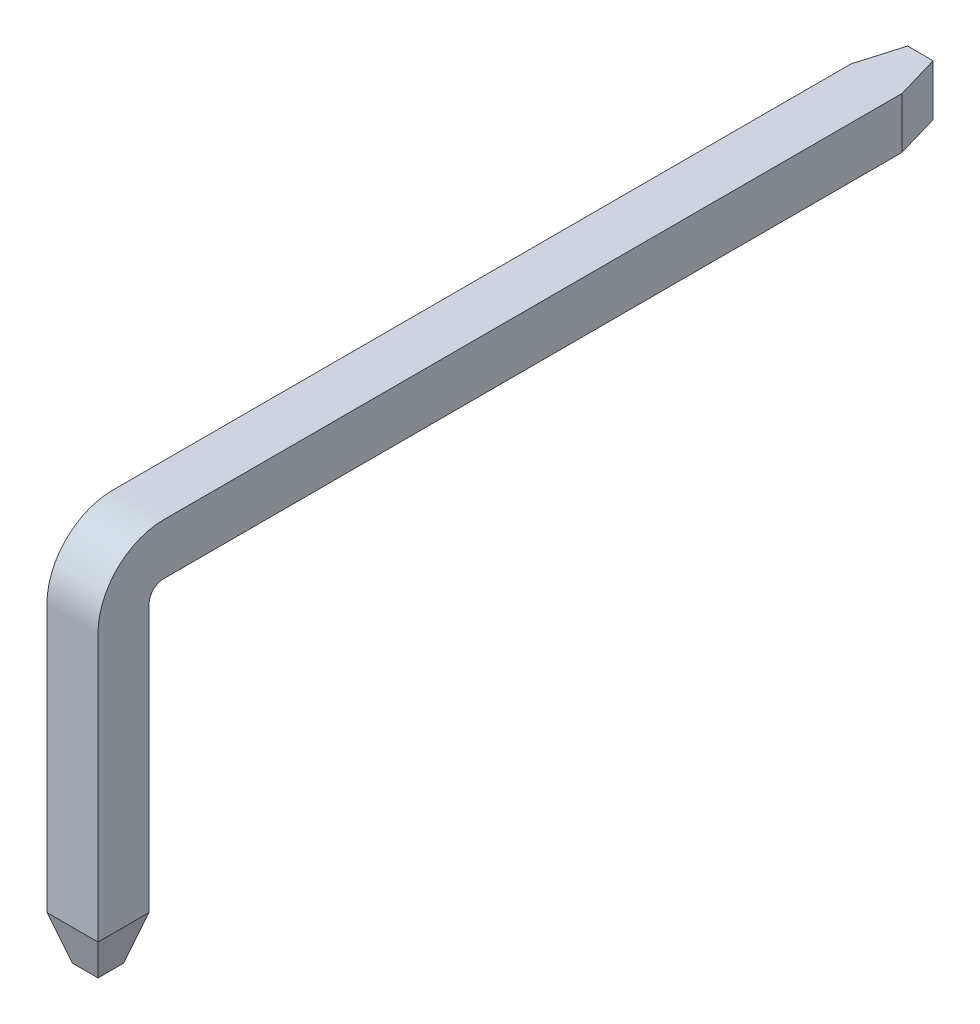
ISO-10303-21;
HEADER;
FILE_DESCRIPTION(('STEP AP214'),'2;1');
FILE_NAME('part.step','',(''),(''),'','','');
FILE_SCHEMA(('AUTOMOTIVE_DESIGN { 1 0 10303 214 1 1 1 1 }'));
ENDSEC;
DATA;
#1=APPLICATION_CONTEXT('core data for automotive mechanical design processes');
#2=APPLICATION_PROTOCOL_DEFINITION('international standard','automotive_design',2000,#1);
#3=PRODUCT_CONTEXT('',#1,'mechanical');
#4=PRODUCT('Part','Part','',(#3));
#5=PRODUCT_RELATED_PRODUCT_CATEGORY('part','',(#4));
#6=PRODUCT_DEFINITION_FORMATION('','',#4);
#7=PRODUCT_DEFINITION_CONTEXT('part definition',#1,'design');
#8=PRODUCT_DEFINITION('design','',#6,#7);
#9=PRODUCT_DEFINITION_SHAPE('','',#8);
#10=(LENGTH_UNIT() NAMED_UNIT(*) SI_UNIT(.MILLI.,.METRE.));
#11=(NAMED_UNIT(*) PLANE_ANGLE_UNIT() SI_UNIT($,.RADIAN.));
#12=(NAMED_UNIT(*) SI_UNIT($,.STERADIAN.) SOLID_ANGLE_UNIT());
#13=UNCERTAINTY_MEASURE_WITH_UNIT(LENGTH_MEASURE(1.E-05),#10,'distance_accuracy_value','');
#14=(GEOMETRIC_REPRESENTATION_CONTEXT(3) GLOBAL_UNCERTAINTY_ASSIGNED_CONTEXT((#13)) GLOBAL_UNIT_ASSIGNED_CONTEXT((#10,
#11,#12)) REPRESENTATION_CONTEXT('',''));
#15=CARTESIAN_POINT('',(0.,0.,0.));
#16=DIRECTION('',(0.,0.,1.));
#17=DIRECTION('',(1.,0.,0.));
#18=AXIS2_PLACEMENT_3D('',#15,#16,#17);
#19=CARTESIAN_POINT('',(0.,-4.4,10.3));
#20=DIRECTION('',(0.,-1.,0.));
#21=DIRECTION('',(1.,0.,0.));
#22=AXIS2_PLACEMENT_3D('',#19,#20,#21);
#23=PLANE('',#22);
#24=DIRECTION('',(-1.,0.,0.));
#25=VECTOR('',#24,1.);
#26=CARTESIAN_POINT('',(-0.32,-4.4,10.46));
#27=LINE('',#26,#25);
#28=CARTESIAN_POINT('',(0.16,-4.4,10.46));
#29=VERTEX_POINT('',#28);
#30=CARTESIAN_POINT('',(-0.16,-4.4,10.46));
#31=VERTEX_POINT('',#30);
#32=EDGE_CURVE('E310',#29,#31,#27,.T.);
#33=ORIENTED_EDGE('',*,*,#32,.T.);
#34=DIRECTION('',(0.,0.,-1.));
#35=VECTOR('',#34,1.);
#36=CARTESIAN_POINT('',(-0.16,-4.4,9.98));
#37=LINE('',#36,#35);
#38=CARTESIAN_POINT('',(-0.16,-4.4,10.14));
#39=VERTEX_POINT('',#38);
#40=EDGE_CURVE('E307',#31,#39,#37,.T.);
#41=ORIENTED_EDGE('',*,*,#40,.T.);
#42=DIRECTION('',(1.,0.,0.));
#43=VECTOR('',#42,1.);
#44=CARTESIAN_POINT('',(0.32,-4.4,10.14));
#45=LINE('',#44,#43);
#46=CARTESIAN_POINT('',(0.16,-4.4,10.14));
#47=VERTEX_POINT('',#46);
#48=EDGE_CURVE('E314',#39,#47,#45,.T.);
#49=ORIENTED_EDGE('',*,*,#48,.T.);
#50=DIRECTION('',(0.,0.,1.));
#51=VECTOR('',#50,1.);
#52=CARTESIAN_POINT('',(0.16,-4.4,10.62));
#53=LINE('',#52,#51);
#54=EDGE_CURVE('E312',#47,#29,#53,.T.);
#55=ORIENTED_EDGE('',*,*,#54,.T.);
#56=EDGE_LOOP('',(#33,#41,#49,#55));
#57=FACE_BOUND('',#56,.T.);
#58=ADVANCED_FACE('F35',(#57),#23,.T.);
#59=CARTESIAN_POINT('',(0.,0.,0.));
#60=DIRECTION('',(0.,0.,1.));
#61=DIRECTION('',(1.,0.,0.));
#62=AXIS2_PLACEMENT_3D('',#59,#60,#61);
#63=PLANE('',#62);
#64=DIRECTION('',(1.,0.,0.));
#65=VECTOR('',#64,1.);
#66=CARTESIAN_POINT('',(-0.32,-0.32,0.));
#67=LINE('',#66,#65);
#68=CARTESIAN_POINT('',(-0.160000000000001,-0.32,0.));
#69=VERTEX_POINT('',#68);
#70=CARTESIAN_POINT('',(0.16,-0.32,0.));
#71=VERTEX_POINT('',#70);
#72=EDGE_CURVE('E221',#69,#71,#67,.T.);
#73=ORIENTED_EDGE('',*,*,#72,.F.);
#74=DIRECTION('',(0.,1.,0.));
#75=VECTOR('',#74,1.);
#76=CARTESIAN_POINT('',(-0.160000000000001,0.,0.));
#77=LINE('',#76,#75);
#78=CARTESIAN_POINT('',(-0.160000000000001,0.32,0.));
#79=VERTEX_POINT('',#78);
#80=EDGE_CURVE('E273',#69,#79,#77,.T.);
#81=ORIENTED_EDGE('',*,*,#80,.T.);
#82=DIRECTION('',(-1.,0.,0.));
#83=VECTOR('',#82,1.);
#84=CARTESIAN_POINT('',(-0.32,0.32,0.));
#85=LINE('',#84,#83);
#86=CARTESIAN_POINT('',(0.16,0.32,0.));
#87=VERTEX_POINT('',#86);
#88=EDGE_CURVE('E133',#87,#79,#85,.T.);
#89=ORIENTED_EDGE('',*,*,#88,.F.);
#90=DIRECTION('',(0.,-1.,0.));
#91=VECTOR('',#90,1.);
#92=CARTESIAN_POINT('',(0.16,0.,0.));
#93=LINE('',#92,#91);
#94=EDGE_CURVE('E319',#87,#71,#93,.T.);
#95=ORIENTED_EDGE('',*,*,#94,.T.);
#96=EDGE_LOOP('',(#73,#81,#89,#95));
#97=FACE_BOUND('',#96,.T.);
#98=ADVANCED_FACE('F203',(#97),#63,.F.);
#99=CARTESIAN_POINT('',(-0.32,-4.4,10.62));
#100=DIRECTION('',(1.,0.,0.));
#101=DIRECTION('',(0.,0.,-1.));
#102=AXIS2_PLACEMENT_3D('',#99,#100,#101);
#103=PLANE('',#102);
#104=DIRECTION('',(0.,1.,0.));
#105=VECTOR('',#104,1.);
#106=CARTESIAN_POINT('',(-0.32,-4.4,9.98));
#107=LINE('',#106,#105);
#108=CARTESIAN_POINT('',(-0.32,-3.85,9.98));
#109=VERTEX_POINT('',#108);
#110=CARTESIAN_POINT('',(-0.32,-0.500000000000001,9.98));
#111=VERTEX_POINT('',#110);
#112=EDGE_CURVE('E167',#109,#111,#107,.T.);
#113=ORIENTED_EDGE('',*,*,#112,.F.);
#114=DIRECTION('',(0.,0.,1.));
#115=VECTOR('',#114,1.);
#116=CARTESIAN_POINT('',(-0.32,-3.85,10.62));
#117=LINE('',#116,#115);
#118=CARTESIAN_POINT('',(-0.32,-3.85,10.62));
#119=VERTEX_POINT('',#118);
#120=EDGE_CURVE('E163',#109,#119,#117,.T.);
#121=ORIENTED_EDGE('',*,*,#120,.T.);
#122=DIRECTION('',(0.,1.,0.));
#123=VECTOR('',#122,1.);
#124=CARTESIAN_POINT('',(-0.32,-4.4,10.62));
#125=LINE('',#124,#123);
#126=CARTESIAN_POINT('',(-0.32,-0.500000000000001,10.62));
#127=VERTEX_POINT('',#126);
#128=EDGE_CURVE('E301',#119,#127,#125,.T.);
#129=ORIENTED_EDGE('',*,*,#128,.T.);
#130=CARTESIAN_POINT('',(-0.32,-0.500000000000001,9.8));
#131=DIRECTION('',(-1.,0.,0.));
#132=DIRECTION('',(0.,0.,1.));
#133=AXIS2_PLACEMENT_3D('',#130,#131,#132);
#134=CIRCLE('',#133,0.820000000000001);
#135=CARTESIAN_POINT('',(-0.32,0.319999999999999,9.8));
#136=VERTEX_POINT('',#135);
#137=EDGE_CURVE('E161',#127,#136,#134,.T.);
#138=ORIENTED_EDGE('',*,*,#137,.T.);
#139=DIRECTION('',(0.,0.,-1.));
#140=VECTOR('',#139,1.);
#141=CARTESIAN_POINT('',(-0.32,0.319999999999999,9.8));
#142=LINE('',#141,#140);
#143=CARTESIAN_POINT('',(-0.32,0.32,0.550000000000002));
#144=VERTEX_POINT('',#143);
#145=EDGE_CURVE('E139',#136,#144,#142,.T.);
#146=ORIENTED_EDGE('',*,*,#145,.T.);
#147=DIRECTION('',(0.,-1.,0.));
#148=VECTOR('',#147,1.);
#149=CARTESIAN_POINT('',(-0.319999999999999,-4.4,0.550000000000002));
#150=LINE('',#149,#148);
#151=CARTESIAN_POINT('',(-0.32,-0.32,0.550000000000002));
#152=VERTEX_POINT('',#151);
#153=EDGE_CURVE('E231',#144,#152,#150,.T.);
#154=ORIENTED_EDGE('',*,*,#153,.T.);
#155=DIRECTION('',(0.,0.,-1.));
#156=VECTOR('',#155,1.);
#157=CARTESIAN_POINT('',(-0.32,-0.320000000000001,9.8));
#158=LINE('',#157,#156);
#159=CARTESIAN_POINT('',(-0.32,-0.320000000000001,9.8));
#160=VERTEX_POINT('',#159);
#161=EDGE_CURVE('E224',#160,#152,#158,.T.);
#162=ORIENTED_EDGE('',*,*,#161,.F.);
#163=CARTESIAN_POINT('',(-0.32,-0.500000000000001,9.8));
#164=DIRECTION('',(-1.,0.,0.));
#165=DIRECTION('',(0.,0.,1.));
#166=AXIS2_PLACEMENT_3D('',#163,#164,#165);
#167=CIRCLE('',#166,0.18);
#168=EDGE_CURVE('E170',#111,#160,#167,.T.);
#169=ORIENTED_EDGE('',*,*,#168,.F.);
#170=EDGE_LOOP('',(#113,#121,#129,#138,#146,#154,#162,#169));
#171=FACE_BOUND('',#170,.T.);
#172=ADVANCED_FACE('F193',(#171),#103,.F.);
#173=CARTESIAN_POINT('',(-0.32,-4.4,9.98));
#174=CARTESIAN_POINT('',(-0.32,-3.75000000000022,9.98));
#175=CARTESIAN_POINT('',(-0.32,-3.09999999999971,9.98));
#176=CARTESIAN_POINT('',(-0.32,-2.12500000000015,9.98));
#177=CARTESIAN_POINT('',(-0.32,-1.80000000000007,9.98));
#178=CARTESIAN_POINT('',(-0.32,-1.31249999999997,9.98));
#179=CARTESIAN_POINT('',(-0.32,-1.15,9.98));
#180=CARTESIAN_POINT('',(-0.32,-0.90625,9.98));
#181=CARTESIAN_POINT('',(-0.32,-0.824999999999983,9.98));
#182=CARTESIAN_POINT('',(-0.32,-0.70312500000001,9.98));
#183=CARTESIAN_POINT('',(-0.32,-0.662499999999999,9.98));
#184=CARTESIAN_POINT('',(-0.32,-0.58125,9.98));
#185=CARTESIAN_POINT('',(-0.32,-0.527624159814461,9.98000731082704));
#186=CARTESIAN_POINT('',(-0.32,-0.455495457674516,9.9799882217228));
#187=CARTESIAN_POINT('',(-0.32,-0.453294441046226,9.97541634727505));
#188=CARTESIAN_POINT('',(-0.32,-0.409822443711961,9.95754463056123));
#189=CARTESIAN_POINT('',(-0.32,-0.389586863291393,9.94414530451856));
#190=CARTESIAN_POINT('',(-0.32,-0.355854695481454,9.9104131367086));
#191=CARTESIAN_POINT('',(-0.32,-0.342455369438716,9.89017755628802));
#192=CARTESIAN_POINT('',(-0.32,-0.324583652725,9.8467055589538));
#193=CARTESIAN_POINT('',(-0.32,-0.32001177827718,9.8445045423256));
#194=CARTESIAN_POINT('',(-0.32,-0.319990814601934,9.76529272228431));
#195=CARTESIAN_POINT('',(-0.32,-0.320000000000001,9.69791666666671));
#196=CARTESIAN_POINT('',(-0.32,-0.320000000000001,9.59583333333329));
#197=CARTESIAN_POINT('',(-0.32,-0.320000000000001,9.54479166666679));
#198=CARTESIAN_POINT('',(-0.32,-0.320000000000001,9.3916666666664));
#199=CARTESIAN_POINT('',(-0.32,-0.320000000000001,9.28958333333342));
#200=CARTESIAN_POINT('',(-0.32,-0.320000000000001,8.98333333333316));
#201=CARTESIAN_POINT('',(-0.32,-0.320000000000001,8.77916666666666));
#202=CARTESIAN_POINT('',(-0.32,-0.320000000000001,8.16666666666667));
#203=CARTESIAN_POINT('',(-0.32,-0.320000000000012,7.75833333333368));
#204=CARTESIAN_POINT('',(-0.32,-0.319999999999979,6.53333333333263));
#205=CARTESIAN_POINT('',(-0.32,-0.320000000000001,5.71666666666767));
#206=CARTESIAN_POINT('',(-0.32,-0.320000000000001,3.26666666666466));
#207=CARTESIAN_POINT('',(-0.32,-0.32,1.63333333333483));
#208=CARTESIAN_POINT('',(-0.32,-0.32,0.));
#209=CARTESIAN_POINT('',(0.32,-4.4,9.98));
#210=CARTESIAN_POINT('',(0.32,-3.75000000000022,9.98));
#211=CARTESIAN_POINT('',(0.32,-3.09999999999971,9.98));
#212=CARTESIAN_POINT('',(0.32,-2.12500000000015,9.98));
#213=CARTESIAN_POINT('',(0.32,-1.80000000000007,9.98));
#214=CARTESIAN_POINT('',(0.32,-1.31249999999997,9.98));
#215=CARTESIAN_POINT('',(0.32,-1.15,9.98));
#216=CARTESIAN_POINT('',(0.32,-0.90625,9.98));
#217=CARTESIAN_POINT('',(0.32,-0.824999999999983,9.98));
#218=CARTESIAN_POINT('',(0.32,-0.70312500000001,9.98));
#219=CARTESIAN_POINT('',(0.32,-0.662499999999999,9.98));
#220=CARTESIAN_POINT('',(0.32,-0.58125,9.98));
#221=CARTESIAN_POINT('',(0.32,-0.527624159814461,9.98000731082704));
#222=CARTESIAN_POINT('',(0.32,-0.455495457674516,9.9799882217228));
#223=CARTESIAN_POINT('',(0.32,-0.453294441046226,9.97541634727505));
#224=CARTESIAN_POINT('',(0.32,-0.409822443711961,9.95754463056123));
#225=CARTESIAN_POINT('',(0.32,-0.389586863291393,9.94414530451856));
#226=CARTESIAN_POINT('',(0.32,-0.355854695481454,9.9104131367086));
#227=CARTESIAN_POINT('',(0.32,-0.342455369438716,9.89017755628802));
#228=CARTESIAN_POINT('',(0.32,-0.324583652725,9.8467055589538));
#229=CARTESIAN_POINT('',(0.32,-0.32001177827718,9.8445045423256));
#230=CARTESIAN_POINT('',(0.32,-0.319990814601934,9.76529272228431));
#231=CARTESIAN_POINT('',(0.32,-0.320000000000001,9.69791666666671));
#232=CARTESIAN_POINT('',(0.32,-0.320000000000001,9.59583333333329));
#233=CARTESIAN_POINT('',(0.32,-0.320000000000001,9.54479166666679));
#234=CARTESIAN_POINT('',(0.32,-0.320000000000001,9.3916666666664));
#235=CARTESIAN_POINT('',(0.32,-0.320000000000001,9.28958333333342));
#236=CARTESIAN_POINT('',(0.32,-0.320000000000001,8.98333333333316));
#237=CARTESIAN_POINT('',(0.32,-0.320000000000001,8.77916666666666));
#238=CARTESIAN_POINT('',(0.32,-0.320000000000001,8.16666666666667));
#239=CARTESIAN_POINT('',(0.32,-0.320000000000012,7.75833333333368));
#240=CARTESIAN_POINT('',(0.32,-0.319999999999979,6.53333333333263));
#241=CARTESIAN_POINT('',(0.32,-0.320000000000001,5.71666666666767));
#242=CARTESIAN_POINT('',(0.32,-0.320000000000001,3.26666666666466));
#243=CARTESIAN_POINT('',(0.32,-0.32,1.63333333333483));
#244=CARTESIAN_POINT('',(0.32,-0.32,0.));
#245=B_SPLINE_SURFACE_WITH_KNOTS('',1,3,((#173,#174,#175,#176,#177,#178,#179,#180,#181,#182,
#183,#184,#185,#186,#187,#188,#189,#190,#191,#192,#193,#194,#195,#196,#197,#198,#199,#200,#201,
#202,#203,#204,#205,#206,#207,#208),(#209,#210,#211,#212,#213,#214,#215,#216,#217,#218,#219,
#220,#221,#222,#223,#224,#225,#226,#227,#228,#229,#230,#231,#232,#233,#234,#235,#236,#237,#238,
#239,#240,#241,#242,#243,#244)),.UNSPECIFIED.,.F.,.F.,.F.,(2,2),(4,2,2,2,2,2,2,2,2,2,2,2,2,2,2,
2,2,4),(0.,1.),(0.,0.134618322396368,0.201927483594553,0.235582064193645,0.252409354493191,
0.260822999642964,0.269236644792737,0.282791642635013,0.296346640477289,0.309901638319565,
0.323456636161841,0.334027626221812,0.344598616281783,0.365740596401726,0.408024556641611,
0.492592477121381,0.66172831808092,1.),.UNSPECIFIED.);
#246=DIRECTION('',(0.,1.,0.));
#247=VECTOR('',#246,1.);
#248=CARTESIAN_POINT('',(0.32,-4.4,9.98));
#249=LINE('',#248,#247);
#250=CARTESIAN_POINT('',(0.32,-3.85,9.98));
#251=VERTEX_POINT('',#250);
#252=CARTESIAN_POINT('',(0.32,-0.500000000000001,9.98));
#253=VERTEX_POINT('',#252);
#254=EDGE_CURVE('E162',#251,#253,#249,.T.);
#255=DIRECTION('',(1.,0.,0.));
#256=VECTOR('',#255,1.);
#257=CARTESIAN_POINT('',(0.32,-3.85,9.98));
#258=LINE('',#257,#256);
#259=EDGE_CURVE('E11',#251,#109,#258,.F.);
#260=CARTESIAN_POINT('',(-0.319999999999999,-0.32,0.550000000000002));
#261=CARTESIAN_POINT('',(-0.307010212911242,-0.32,0.505347606882397));
#262=CARTESIAN_POINT('',(-0.294020425822484,-0.32,0.460695213764793));
#263=CARTESIAN_POINT('',(-0.240687092489151,-0.32,0.277361880431459));
#264=CARTESIAN_POINT('',(-0.200343546244576,-0.32,0.138680940215729));
#265=CARTESIAN_POINT('',(-0.160000000000001,-0.32,0.));
#266=B_SPLINE_CURVE_WITH_KNOTS('',3,(#260,#261,#262,#263,#264,#265),.UNSPECIFIED.,.F.,.F.,(4,2,
4),(0.,0.139510347349805,0.572800139664789),.UNSPECIFIED.);
#267=EDGE_CURVE('E238',#152,#69,#266,.T.);
#268=CARTESIAN_POINT('',(0.16,-0.32,0.));
#269=CARTESIAN_POINT('',(0.172989787088758,-0.32,0.0446523931176045));
#270=CARTESIAN_POINT('',(0.185979574177516,-0.32,0.0893047862352089));
#271=CARTESIAN_POINT('',(0.239312907510849,-0.32,0.272638119568544));
#272=CARTESIAN_POINT('',(0.279656453755425,-0.32,0.411319059784275));
#273=CARTESIAN_POINT('',(0.32,-0.32,0.550000000000006));
#274=B_SPLINE_CURVE_WITH_KNOTS('',3,(#268,#269,#270,#271,#272,#273),.UNSPECIFIED.,.F.,.F.,(4,2,
4),(0.,0.139510347349805,0.572800139664793),.UNSPECIFIED.);
#275=CARTESIAN_POINT('',(0.32,-0.32,0.550000000000005));
#276=VERTEX_POINT('',#275);
#277=EDGE_CURVE('E239',#71,#276,#274,.T.);
#278=DIRECTION('',(0.,0.,-1.));
#279=VECTOR('',#278,1.);
#280=CARTESIAN_POINT('',(0.32,-0.320000000000001,9.8));
#281=LINE('',#280,#279);
#282=CARTESIAN_POINT('',(0.32,-0.320000000000001,9.8));
#283=VERTEX_POINT('',#282);
#284=EDGE_CURVE('E134',#283,#276,#281,.T.);
#285=CARTESIAN_POINT('',(0.32,-0.500000000000001,9.8));
#286=DIRECTION('',(-1.,0.,0.));
#287=DIRECTION('',(0.,0.,1.));
#288=AXIS2_PLACEMENT_3D('',#285,#286,#287);
#289=CIRCLE('',#288,0.18);
#290=EDGE_CURVE('E140',#253,#283,#289,.T.);
#291=ORIENTED_EDGE('',*,*,#254,.F.);
#292=ORIENTED_EDGE('',*,*,#259,.T.);
#293=ORIENTED_EDGE('',*,*,#112,.T.);
#294=ORIENTED_EDGE('',*,*,#168,.T.);
#295=ORIENTED_EDGE('',*,*,#161,.T.);
#296=ORIENTED_EDGE('',*,*,#267,.T.);
#297=ORIENTED_EDGE('',*,*,#72,.T.);
#298=ORIENTED_EDGE('',*,*,#277,.T.);
#299=ORIENTED_EDGE('',*,*,#284,.F.);
#300=ORIENTED_EDGE('',*,*,#290,.F.);
#301=EDGE_LOOP('',(#291,#292,#293,#294,#295,#296,#297,#298,#299,#300));
#302=FACE_BOUND('',#301,.T.);
#303=ADVANCED_FACE('F202',(#302),#245,.F.);
#304=CARTESIAN_POINT('',(0.32,-4.4,10.62));
#305=DIRECTION('',(-1.,0.,0.));
#306=DIRECTION('',(0.,0.,1.));
#307=AXIS2_PLACEMENT_3D('',#304,#305,#306);
#308=PLANE('',#307);
#309=DIRECTION('',(0.,1.,0.));
#310=VECTOR('',#309,1.);
#311=CARTESIAN_POINT('',(0.32,-4.4,10.62));
#312=LINE('',#311,#310);
#313=CARTESIAN_POINT('',(0.32,-3.85,10.62));
#314=VERTEX_POINT('',#313);
#315=CARTESIAN_POINT('',(0.32,-0.500000000000001,10.62));
#316=VERTEX_POINT('',#315);
#317=EDGE_CURVE('E138',#314,#316,#312,.T.);
#318=ORIENTED_EDGE('',*,*,#317,.F.);
#319=DIRECTION('',(0.,0.,-1.));
#320=VECTOR('',#319,1.);
#321=CARTESIAN_POINT('',(0.32,-3.85,9.98));
#322=LINE('',#321,#320);
#323=EDGE_CURVE('E44',#314,#251,#322,.T.);
#324=ORIENTED_EDGE('',*,*,#323,.T.);
#325=ORIENTED_EDGE('',*,*,#254,.T.);
#326=ORIENTED_EDGE('',*,*,#290,.T.);
#327=ORIENTED_EDGE('',*,*,#284,.T.);
#328=DIRECTION('',(0.,1.,0.));
#329=VECTOR('',#328,1.);
#330=CARTESIAN_POINT('',(0.32,-4.4,0.550000000000005));
#331=LINE('',#330,#329);
#332=CARTESIAN_POINT('',(0.32,0.32,0.550000000000005));
#333=VERTEX_POINT('',#332);
#334=EDGE_CURVE('E132',#276,#333,#331,.T.);
#335=ORIENTED_EDGE('',*,*,#334,.T.);
#336=DIRECTION('',(0.,0.,-1.));
#337=VECTOR('',#336,1.);
#338=CARTESIAN_POINT('',(0.32,0.319999999999999,9.8));
#339=LINE('',#338,#337);
#340=CARTESIAN_POINT('',(0.32,0.319999999999999,9.8));
#341=VERTEX_POINT('',#340);
#342=EDGE_CURVE('E125',#341,#333,#339,.T.);
#343=ORIENTED_EDGE('',*,*,#342,.F.);
#344=CARTESIAN_POINT('',(0.32,-0.500000000000001,9.8));
#345=DIRECTION('',(-1.,0.,0.));
#346=DIRECTION('',(0.,0.,1.));
#347=AXIS2_PLACEMENT_3D('',#344,#345,#346);
#348=CIRCLE('',#347,0.820000000000001);
#349=EDGE_CURVE('E128',#316,#341,#348,.T.);
#350=ORIENTED_EDGE('',*,*,#349,.F.);
#351=EDGE_LOOP('',(#318,#324,#325,#326,#327,#335,#343,#350));
#352=FACE_BOUND('',#351,.T.);
#353=ADVANCED_FACE('F127',(#352),#308,.F.);
#354=CARTESIAN_POINT('',(0.32,-4.4,10.62));
#355=CARTESIAN_POINT('',(0.32,-3.75000000000022,10.62));
#356=CARTESIAN_POINT('',(0.32,-3.09999999999971,10.62));
#357=CARTESIAN_POINT('',(0.32,-2.12500000000015,10.62));
#358=CARTESIAN_POINT('',(0.32,-1.80000000000007,10.62));
#359=CARTESIAN_POINT('',(0.32,-1.31249999999997,10.62));
#360=CARTESIAN_POINT('',(0.32,-1.15,10.62));
#361=CARTESIAN_POINT('',(0.32,-0.90625,10.62));
#362=CARTESIAN_POINT('',(0.32,-0.824999999999983,10.62));
#363=CARTESIAN_POINT('',(0.32,-0.70312500000001,10.62));
#364=CARTESIAN_POINT('',(0.32,-0.662499999999999,10.62));
#365=CARTESIAN_POINT('',(0.32,-0.58125,10.62));
#366=CARTESIAN_POINT('',(0.32,-0.553621172488102,10.6200333048787));
#367=CARTESIAN_POINT('',(0.32,-0.413612368427957,10.6199463434039));
#368=CARTESIAN_POINT('',(0.32,-0.2872302314328,10.5991189153639));
#369=CARTESIAN_POINT('',(0.32,-0.0891911324655984,10.5177033170014));
#370=CARTESIAN_POINT('',(0.32,0.00299317833920369,10.4566619428067));
#371=CARTESIAN_POINT('',(0.32,0.15666194280672,10.3029931783393));
#372=CARTESIAN_POINT('',(0.32,0.217703317001405,10.2108088675344));
#373=CARTESIAN_POINT('',(0.32,0.299118915363896,10.0127697685672));
#374=CARTESIAN_POINT('',(0.32,0.319946343403956,9.88638763157213));
#375=CARTESIAN_POINT('',(0.32,0.320041844591198,9.73262980892514));
#376=CARTESIAN_POINT('',(0.32,0.319999999999999,9.69791666666671));
#377=CARTESIAN_POINT('',(0.32,0.319999999999999,9.59583333333329));
#378=CARTESIAN_POINT('',(0.32,0.319999999999999,9.54479166666679));
#379=CARTESIAN_POINT('',(0.32,0.319999999999999,9.3916666666664));
#380=CARTESIAN_POINT('',(0.32,0.319999999999999,9.28958333333342));
#381=CARTESIAN_POINT('',(0.32,0.319999999999999,8.98333333333316));
#382=CARTESIAN_POINT('',(0.32,0.319999999999999,8.77916666666666));
#383=CARTESIAN_POINT('',(0.32,0.319999999999999,8.16666666666667));
#384=CARTESIAN_POINT('',(0.32,0.319999999999988,7.75833333333368));
#385=CARTESIAN_POINT('',(0.32,0.320000000000021,6.53333333333263));
#386=CARTESIAN_POINT('',(0.32,0.319999999999999,5.71666666666767));
#387=CARTESIAN_POINT('',(0.32,0.319999999999999,3.26666666666466));
#388=CARTESIAN_POINT('',(0.32,0.32,1.63333333333483));
#389=CARTESIAN_POINT('',(0.32,0.32,0.));
#390=CARTESIAN_POINT('',(-0.32,-4.4,10.62));
#391=CARTESIAN_POINT('',(-0.32,-3.75000000000022,10.62));
#392=CARTESIAN_POINT('',(-0.32,-3.09999999999971,10.62));
#393=CARTESIAN_POINT('',(-0.32,-2.12500000000015,10.62));
#394=CARTESIAN_POINT('',(-0.32,-1.80000000000007,10.62));
#395=CARTESIAN_POINT('',(-0.32,-1.31249999999997,10.62));
#396=CARTESIAN_POINT('',(-0.32,-1.15,10.62));
#397=CARTESIAN_POINT('',(-0.32,-0.90625,10.62));
#398=CARTESIAN_POINT('',(-0.32,-0.824999999999983,10.62));
#399=CARTESIAN_POINT('',(-0.32,-0.70312500000001,10.62));
#400=CARTESIAN_POINT('',(-0.32,-0.662499999999999,10.62));
#401=CARTESIAN_POINT('',(-0.32,-0.58125,10.62));
#402=CARTESIAN_POINT('',(-0.32,-0.553621172488102,10.6200333048787));
#403=CARTESIAN_POINT('',(-0.32,-0.413612368427957,10.6199463434039));
#404=CARTESIAN_POINT('',(-0.32,-0.2872302314328,10.5991189153639));
#405=CARTESIAN_POINT('',(-0.32,-0.0891911324655984,10.5177033170014));
#406=CARTESIAN_POINT('',(-0.32,0.00299317833920369,10.4566619428067));
#407=CARTESIAN_POINT('',(-0.32,0.15666194280672,10.3029931783393));
#408=CARTESIAN_POINT('',(-0.32,0.217703317001405,10.2108088675344));
#409=CARTESIAN_POINT('',(-0.32,0.299118915363896,10.0127697685672));
#410=CARTESIAN_POINT('',(-0.32,0.319946343403956,9.88638763157213));
#411=CARTESIAN_POINT('',(-0.32,0.320041844591198,9.73262980892514));
#412=CARTESIAN_POINT('',(-0.32,0.319999999999999,9.69791666666671));
#413=CARTESIAN_POINT('',(-0.32,0.319999999999999,9.59583333333329));
#414=CARTESIAN_POINT('',(-0.32,0.319999999999999,9.54479166666679));
#415=CARTESIAN_POINT('',(-0.32,0.319999999999999,9.3916666666664));
#416=CARTESIAN_POINT('',(-0.32,0.319999999999999,9.28958333333342));
#417=CARTESIAN_POINT('',(-0.32,0.319999999999999,8.98333333333316));
#418=CARTESIAN_POINT('',(-0.32,0.319999999999999,8.77916666666666));
#419=CARTESIAN_POINT('',(-0.32,0.319999999999999,8.16666666666667));
#420=CARTESIAN_POINT('',(-0.32,0.319999999999988,7.75833333333368));
#421=CARTESIAN_POINT('',(-0.32,0.320000000000021,6.53333333333263));
#422=CARTESIAN_POINT('',(-0.32,0.319999999999999,5.71666666666767));
#423=CARTESIAN_POINT('',(-0.32,0.319999999999999,3.26666666666466));
#424=CARTESIAN_POINT('',(-0.32,0.32,1.63333333333483));
#425=CARTESIAN_POINT('',(-0.32,0.32,0.));
#426=B_SPLINE_SURFACE_WITH_KNOTS('',1,3,((#354,#355,#356,#357,#358,#359,#360,#361,#362,#363,
#364,#365,#366,#367,#368,#369,#370,#371,#372,#373,#374,#375,#376,#377,#378,#379,#380,#381,#382,
#383,#384,#385,#386,#387,#388,#389),(#390,#391,#392,#393,#394,#395,#396,#397,#398,#399,#400,
#401,#402,#403,#404,#405,#406,#407,#408,#409,#410,#411,#412,#413,#414,#415,#416,#417,#418,#419,
#420,#421,#422,#423,#424,#425)),.UNSPECIFIED.,.F.,.F.,.F.,(2,2),(4,2,2,2,2,2,2,2,2,2,2,2,2,2,2,
2,2,4),(0.,1.),(0.,0.134618322396368,0.201927483594553,0.235582064193645,0.252409354493191,
0.260822999642964,0.269236644792737,0.282791642635013,0.296346640477289,0.309901638319565,
0.323456636161841,0.334027626221812,0.344598616281783,0.365740596401726,0.408024556641611,
0.492592477121381,0.66172831808092,1.),.UNSPECIFIED.);
#427=DIRECTION('',(-1.,0.,0.));
#428=VECTOR('',#427,1.);
#429=CARTESIAN_POINT('',(-0.32,-3.85,10.62));
#430=LINE('',#429,#428);
#431=EDGE_CURVE('E59',#119,#314,#430,.F.);
#432=CARTESIAN_POINT('',(0.32,0.32,0.550000000000005));
#433=CARTESIAN_POINT('',(0.266666666666667,0.32,0.36666666666667));
#434=CARTESIAN_POINT('',(0.213333333333334,0.32,0.183333333333335));
#435=CARTESIAN_POINT('',(0.16,0.32,0.));
#436=B_SPLINE_CURVE_WITH_KNOTS('',3,(#432,#433,#434,#435),.UNSPECIFIED.,.F.,.F.,(4,4),(0.,
0.572800139664792),.UNSPECIFIED.);
#437=EDGE_CURVE('E267',#333,#87,#436,.T.);
#438=CARTESIAN_POINT('',(-0.160000000000001,0.32,0.));
#439=CARTESIAN_POINT('',(-0.213333333333334,0.32,0.183333333333334));
#440=CARTESIAN_POINT('',(-0.266666666666667,0.32,0.366666666666667));
#441=CARTESIAN_POINT('',(-0.320000000000001,0.32,0.550000000000001));
#442=B_SPLINE_CURVE_WITH_KNOTS('',3,(#438,#439,#440,#441),.UNSPECIFIED.,.F.,.F.,(4,4),(0.,
0.572800139664788),.UNSPECIFIED.);
#443=EDGE_CURVE('E237',#79,#144,#442,.T.);
#444=ORIENTED_EDGE('',*,*,#128,.F.);
#445=ORIENTED_EDGE('',*,*,#431,.T.);
#446=ORIENTED_EDGE('',*,*,#317,.T.);
#447=ORIENTED_EDGE('',*,*,#349,.T.);
#448=ORIENTED_EDGE('',*,*,#342,.T.);
#449=ORIENTED_EDGE('',*,*,#437,.T.);
#450=ORIENTED_EDGE('',*,*,#88,.T.);
#451=ORIENTED_EDGE('',*,*,#443,.T.);
#452=ORIENTED_EDGE('',*,*,#145,.F.);
#453=ORIENTED_EDGE('',*,*,#137,.F.);
#454=EDGE_LOOP('',(#444,#445,#446,#447,#448,#449,#450,#451,#452,#453));
#455=FACE_BOUND('',#454,.T.);
#456=ADVANCED_FACE('F137',(#455),#426,.F.);
#457=CARTESIAN_POINT('',(-0.319999999999999,-4.4,0.550000000000002));
#458=DIRECTION('',(0.960195296603576,0.,0.279329540830128));
#459=DIRECTION('',(0.,-1.,0.));
#460=AXIS2_PLACEMENT_3D('',#457,#458,#459);
#461=PLANE('',#460);
#462=ORIENTED_EDGE('',*,*,#443,.F.);
#463=ORIENTED_EDGE('',*,*,#80,.F.);
#464=ORIENTED_EDGE('',*,*,#267,.F.);
#465=ORIENTED_EDGE('',*,*,#153,.F.);
#466=EDGE_LOOP('',(#462,#463,#464,#465));
#467=FACE_BOUND('',#466,.T.);
#468=ADVANCED_FACE('F235',(#467),#461,.F.);
#469=CARTESIAN_POINT('',(0.32,-4.4,0.550000000000005));
#470=DIRECTION('',(-0.960195296603576,0.,0.279329540830128));
#471=DIRECTION('',(0.,1.,0.));
#472=AXIS2_PLACEMENT_3D('',#469,#470,#471);
#473=PLANE('',#472);
#474=ORIENTED_EDGE('',*,*,#277,.F.);
#475=ORIENTED_EDGE('',*,*,#94,.F.);
#476=ORIENTED_EDGE('',*,*,#437,.F.);
#477=ORIENTED_EDGE('',*,*,#334,.F.);
#478=EDGE_LOOP('',(#474,#475,#476,#477));
#479=FACE_BOUND('',#478,.T.);
#480=ADVANCED_FACE('F256',(#479),#473,.F.);
#481=CARTESIAN_POINT('',(0.16,-4.4,10.3));
#482=DIRECTION('',(0.960195296603576,-0.27932954083013,0.));
#483=DIRECTION('',(0.,0.,-1.));
#484=AXIS2_PLACEMENT_3D('',#481,#482,#483);
#485=PLANE('',#484);
#486=DIRECTION('',(0.269031078562835,0.924794332559751,-0.269031078562835));
#487=VECTOR('',#486,1.);
#488=CARTESIAN_POINT('',(0.14841956460277,-4.43980774667798,10.1515804353972));
#489=LINE('',#488,#487);
#490=EDGE_CURVE('E305',#251,#47,#489,.F.);
#491=ORIENTED_EDGE('',*,*,#490,.F.);
#492=ORIENTED_EDGE('',*,*,#323,.F.);
#493=DIRECTION('',(0.269031078562835,0.924794332559751,0.269031078562835));
#494=VECTOR('',#493,1.);
#495=CARTESIAN_POINT('',(0.14841956460277,-4.43980774667798,10.4484195646028));
#496=LINE('',#495,#494);
#497=EDGE_CURVE('E39',#29,#314,#496,.T.);
#498=ORIENTED_EDGE('',*,*,#497,.F.);
#499=ORIENTED_EDGE('',*,*,#54,.F.);
#500=EDGE_LOOP('',(#491,#492,#498,#499));
#501=FACE_BOUND('',#500,.T.);
#502=ADVANCED_FACE('F37',(#501),#485,.T.);
#503=CARTESIAN_POINT('',(0.,-4.4,10.46));
#504=DIRECTION('',(0.,0.27932954083013,-0.960195296603576));
#505=DIRECTION('',(-1.,0.,0.));
#506=AXIS2_PLACEMENT_3D('',#503,#504,#505);
#507=PLANE('',#506);
#508=ORIENTED_EDGE('',*,*,#497,.T.);
#509=ORIENTED_EDGE('',*,*,#431,.F.);
#510=DIRECTION('',(-0.269031078562835,0.924794332559751,0.269031078562835));
#511=VECTOR('',#510,1.);
#512=CARTESIAN_POINT('',(-0.14841956460277,-4.43980774667798,10.4484195646028));
#513=LINE('',#512,#511);
#514=EDGE_CURVE('E351',#31,#119,#513,.T.);
#515=ORIENTED_EDGE('',*,*,#514,.F.);
#516=ORIENTED_EDGE('',*,*,#32,.F.);
#517=EDGE_LOOP('',(#508,#509,#515,#516));
#518=FACE_BOUND('',#517,.T.);
#519=ADVANCED_FACE('F364',(#518),#507,.F.);
#520=CARTESIAN_POINT('',(0.,-4.4,10.14));
#521=DIRECTION('',(0.,0.27932954083013,0.960195296603576));
#522=DIRECTION('',(1.,0.,0.));
#523=AXIS2_PLACEMENT_3D('',#520,#521,#522);
#524=PLANE('',#523);
#525=ORIENTED_EDGE('',*,*,#490,.T.);
#526=ORIENTED_EDGE('',*,*,#48,.F.);
#527=DIRECTION('',(0.269031078562835,-0.924794332559751,0.269031078562835));
#528=VECTOR('',#527,1.);
#529=CARTESIAN_POINT('',(-0.14841956460277,-4.43980774667798,10.1515804353972));
#530=LINE('',#529,#528);
#531=EDGE_CURVE('E348',#109,#39,#530,.T.);
#532=ORIENTED_EDGE('',*,*,#531,.F.);
#533=ORIENTED_EDGE('',*,*,#259,.F.);
#534=EDGE_LOOP('',(#525,#526,#532,#533));
#535=FACE_BOUND('',#534,.T.);
#536=ADVANCED_FACE('F354',(#535),#524,.F.);
#537=CARTESIAN_POINT('',(-0.16,-4.4,10.3));
#538=DIRECTION('',(-0.960195296603576,-0.27932954083013,0.));
#539=DIRECTION('',(0.,0.,1.));
#540=AXIS2_PLACEMENT_3D('',#537,#538,#539);
#541=PLANE('',#540);
#542=ORIENTED_EDGE('',*,*,#514,.T.);
#543=ORIENTED_EDGE('',*,*,#120,.F.);
#544=ORIENTED_EDGE('',*,*,#531,.T.);
#545=ORIENTED_EDGE('',*,*,#40,.F.);
#546=EDGE_LOOP('',(#542,#543,#544,#545));
#547=FACE_BOUND('',#546,.T.);
#548=ADVANCED_FACE('F263',(#547),#541,.T.);
#549=CLOSED_SHELL('',(#58,#98,#172,#303,#353,#456,#468,#480,#502,#519,#536,#548));
#550=MANIFOLD_SOLID_BREP('B2',#549);
#551=ADVANCED_BREP_SHAPE_REPRESENTATION('',(#18,#550),#14);
#552=SHAPE_DEFINITION_REPRESENTATION(#9,#551);
ENDSEC;
END-ISO-10303-21;
